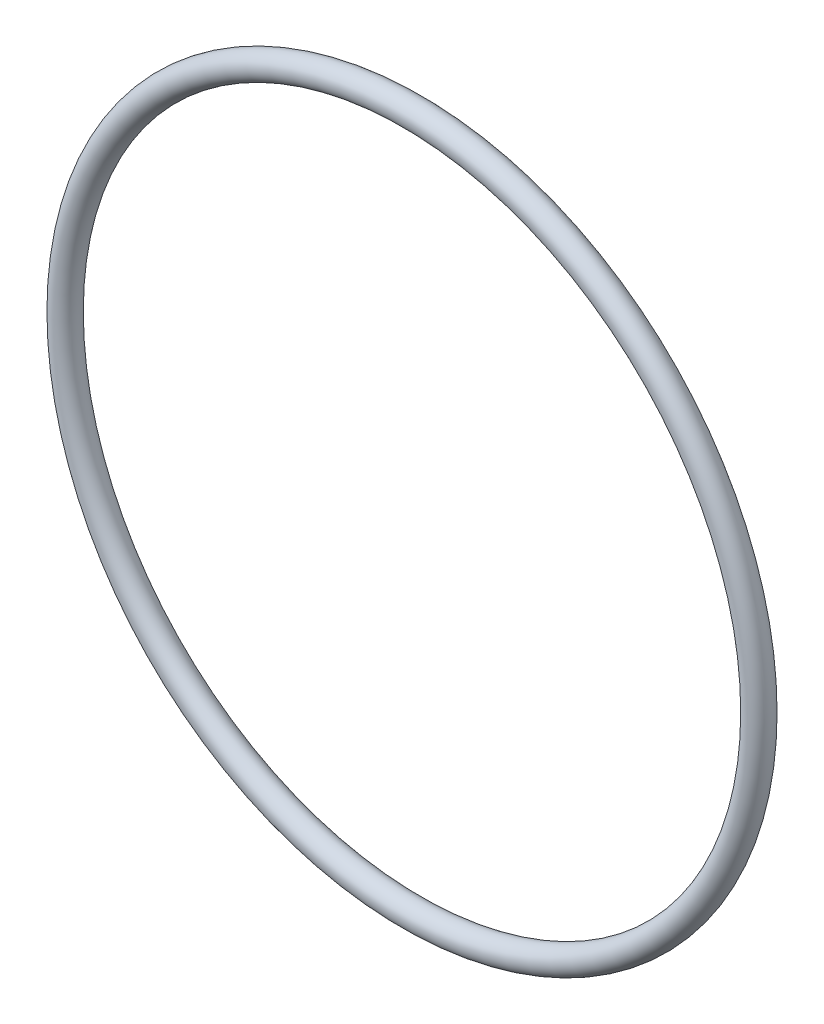
ISO-10303-21;
HEADER;
FILE_DESCRIPTION(('STEP AP214'),'2;1');
FILE_NAME('part.step','',(''),(''),'','','');
FILE_SCHEMA(('AUTOMOTIVE_DESIGN { 1 0 10303 214 1 1 1 1 }'));
ENDSEC;
DATA;
#1=APPLICATION_CONTEXT('core data for automotive mechanical design processes');
#2=APPLICATION_PROTOCOL_DEFINITION('international standard','automotive_design',2000,#1);
#3=PRODUCT_CONTEXT('',#1,'mechanical');
#4=PRODUCT('Part','Part','',(#3));
#5=PRODUCT_RELATED_PRODUCT_CATEGORY('part','',(#4));
#6=PRODUCT_DEFINITION_FORMATION('','',#4);
#7=PRODUCT_DEFINITION_CONTEXT('part definition',#1,'design');
#8=PRODUCT_DEFINITION('design','',#6,#7);
#9=PRODUCT_DEFINITION_SHAPE('','',#8);
#10=(LENGTH_UNIT() NAMED_UNIT(*) SI_UNIT(.MILLI.,.METRE.));
#11=(NAMED_UNIT(*) PLANE_ANGLE_UNIT() SI_UNIT($,.RADIAN.));
#12=(NAMED_UNIT(*) SI_UNIT($,.STERADIAN.) SOLID_ANGLE_UNIT());
#13=UNCERTAINTY_MEASURE_WITH_UNIT(LENGTH_MEASURE(1.E-05),#10,'distance_accuracy_value','');
#14=(GEOMETRIC_REPRESENTATION_CONTEXT(3) GLOBAL_UNCERTAINTY_ASSIGNED_CONTEXT((#13)) GLOBAL_UNIT_ASSIGNED_CONTEXT((#10,
#11,#12)) REPRESENTATION_CONTEXT('',''));
#15=CARTESIAN_POINT('',(0.,0.,0.));
#16=DIRECTION('',(0.,0.,1.));
#17=DIRECTION('',(1.,0.,0.));
#18=AXIS2_PLACEMENT_3D('',#15,#16,#17);
#19=CARTESIAN_POINT('',(0.,0.,0.));
#20=DIRECTION('',(0.,0.,1.));
#21=DIRECTION('',(1.,0.,0.));
#22=AXIS2_PLACEMENT_3D('',#19,#20,#21);
#23=TOROIDAL_SURFACE('',#22,35.2806,1.3081);
#24=CARTESIAN_POINT('',(36.5887,0.,0.));
#25=VERTEX_POINT('',#24);
#26=VERTEX_LOOP('',#25);
#27=FACE_BOUND('',#26,.T.);
#28=ADVANCED_FACE('F28',(#27),#23,.T.);
#29=CLOSED_SHELL('',(#28));
#30=MANIFOLD_SOLID_BREP('B2',#29);
#31=ADVANCED_BREP_SHAPE_REPRESENTATION('',(#18,#30),#14);
#32=SHAPE_DEFINITION_REPRESENTATION(#9,#31);
ENDSEC;
END-ISO-10303-21;
